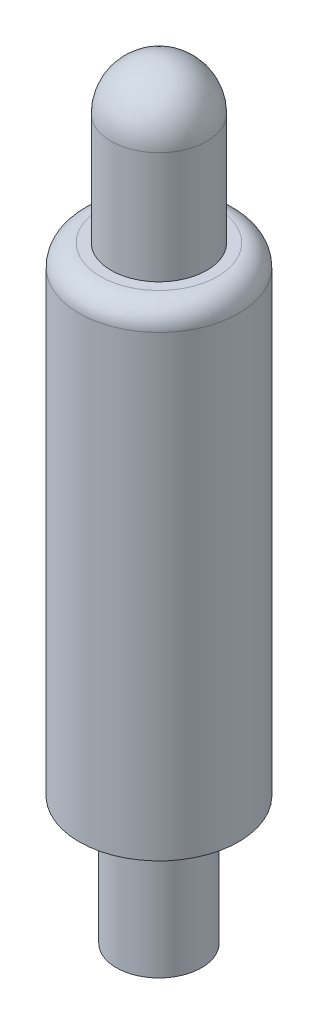
ISO-10303-21;
HEADER;
FILE_DESCRIPTION(('STEP AP214'),'2;1');
FILE_NAME('part.step','',(''),(''),'','','');
FILE_SCHEMA(('AUTOMOTIVE_DESIGN { 1 0 10303 214 1 1 1 1 }'));
ENDSEC;
DATA;
#1=APPLICATION_CONTEXT('core data for automotive mechanical design processes');
#2=APPLICATION_PROTOCOL_DEFINITION('international standard','automotive_design',2000,#1);
#3=PRODUCT_CONTEXT('',#1,'mechanical');
#4=PRODUCT('Part','Part','',(#3));
#5=PRODUCT_RELATED_PRODUCT_CATEGORY('part','',(#4));
#6=PRODUCT_DEFINITION_FORMATION('','',#4);
#7=PRODUCT_DEFINITION_CONTEXT('part definition',#1,'design');
#8=PRODUCT_DEFINITION('design','',#6,#7);
#9=PRODUCT_DEFINITION_SHAPE('','',#8);
#10=(LENGTH_UNIT() NAMED_UNIT(*) SI_UNIT(.MILLI.,.METRE.));
#11=(NAMED_UNIT(*) PLANE_ANGLE_UNIT() SI_UNIT($,.RADIAN.));
#12=(NAMED_UNIT(*) SI_UNIT($,.STERADIAN.) SOLID_ANGLE_UNIT());
#13=UNCERTAINTY_MEASURE_WITH_UNIT(LENGTH_MEASURE(1.E-05),#10,'distance_accuracy_value','');
#14=(GEOMETRIC_REPRESENTATION_CONTEXT(3) GLOBAL_UNCERTAINTY_ASSIGNED_CONTEXT((#13)) GLOBAL_UNIT_ASSIGNED_CONTEXT((#10,
#11,#12)) REPRESENTATION_CONTEXT('',''));
#15=CARTESIAN_POINT('',(0.,0.,0.));
#16=DIRECTION('',(0.,0.,1.));
#17=DIRECTION('',(1.,0.,0.));
#18=AXIS2_PLACEMENT_3D('',#15,#16,#17);
#19=CARTESIAN_POINT('',(0.,4.5,0.));
#20=DIRECTION('',(0.,-1.,0.));
#21=DIRECTION('',(0.,0.,-1.));
#22=AXIS2_PLACEMENT_3D('',#19,#20,#21);
#23=CYLINDRICAL_SURFACE('',#22,0.75);
#24=CARTESIAN_POINT('',(0.,4.3,0.));
#25=DIRECTION('',(0.,1.,0.));
#26=DIRECTION('',(0.,0.,1.));
#27=AXIS2_PLACEMENT_3D('',#24,#25,#26);
#28=CIRCLE('',#27,0.75);
#29=CARTESIAN_POINT('',(0.,4.3,0.75));
#30=VERTEX_POINT('',#29);
#31=EDGE_CURVE('E46',#30,#30,#28,.F.);
#32=ORIENTED_EDGE('',*,*,#31,.T.);
#33=EDGE_LOOP('',(#32));
#34=FACE_BOUND('',#33,.T.);
#35=CARTESIAN_POINT('',(0.,0.,0.));
#36=DIRECTION('',(0.,1.,0.));
#37=DIRECTION('',(0.,0.,1.));
#38=AXIS2_PLACEMENT_3D('',#35,#36,#37);
#39=CIRCLE('',#38,0.75);
#40=CARTESIAN_POINT('',(0.,0.,0.75));
#41=VERTEX_POINT('',#40);
#42=EDGE_CURVE('E57',#41,#41,#39,.T.);
#43=ORIENTED_EDGE('',*,*,#42,.T.);
#44=EDGE_LOOP('',(#43));
#45=FACE_BOUND('',#44,.T.);
#46=ADVANCED_FACE('F39',(#34,#45),#23,.T.);
#47=CARTESIAN_POINT('',(0.,4.5,0.));
#48=DIRECTION('',(0.,1.,0.));
#49=DIRECTION('',(0.,0.,1.));
#50=AXIS2_PLACEMENT_3D('',#47,#48,#49);
#51=PLANE('',#50);
#52=CARTESIAN_POINT('',(0.,4.5,0.));
#53=DIRECTION('',(0.,1.,0.));
#54=DIRECTION('',(0.,0.,1.));
#55=AXIS2_PLACEMENT_3D('',#52,#53,#54);
#56=CIRCLE('',#55,0.55);
#57=CARTESIAN_POINT('',(0.,4.5,0.55));
#58=VERTEX_POINT('',#57);
#59=EDGE_CURVE('E50',#58,#58,#56,.T.);
#60=ORIENTED_EDGE('',*,*,#59,.T.);
#61=EDGE_LOOP('',(#60));
#62=FACE_BOUND('',#61,.T.);
#63=CARTESIAN_POINT('',(0.,4.5,0.));
#64=DIRECTION('',(0.,1.,0.));
#65=DIRECTION('',(0.,0.,1.));
#66=AXIS2_PLACEMENT_3D('',#63,#64,#65);
#67=CIRCLE('',#66,0.45);
#68=CARTESIAN_POINT('',(0.,4.5,0.45));
#69=VERTEX_POINT('',#68);
#70=EDGE_CURVE('E60',#69,#69,#67,.T.);
#71=ORIENTED_EDGE('',*,*,#70,.F.);
#72=EDGE_LOOP('',(#71));
#73=FACE_BOUND('',#72,.T.);
#74=ADVANCED_FACE('F81',(#62,#73),#51,.T.);
#75=CARTESIAN_POINT('',(0.,0.,0.));
#76=DIRECTION('',(0.,1.,0.));
#77=DIRECTION('',(0.,0.,1.));
#78=AXIS2_PLACEMENT_3D('',#75,#76,#77);
#79=PLANE('',#78);
#80=CARTESIAN_POINT('',(0.,0.,0.));
#81=DIRECTION('',(0.,-1.,0.));
#82=DIRECTION('',(0.,0.,-1.));
#83=AXIS2_PLACEMENT_3D('',#80,#81,#82);
#84=CIRCLE('',#83,0.4);
#85=CARTESIAN_POINT('',(0.,0.,-0.4));
#86=VERTEX_POINT('',#85);
#87=EDGE_CURVE('E54',#86,#86,#84,.T.);
#88=ORIENTED_EDGE('',*,*,#87,.F.);
#89=EDGE_LOOP('',(#88));
#90=FACE_BOUND('',#89,.T.);
#91=ORIENTED_EDGE('',*,*,#42,.F.);
#92=EDGE_LOOP('',(#91));
#93=FACE_BOUND('',#92,.T.);
#94=ADVANCED_FACE('F78',(#90,#93),#79,.F.);
#95=CARTESIAN_POINT('',(0.,6.,0.));
#96=DIRECTION('',(0.,-1.,0.));
#97=DIRECTION('',(0.,0.,-1.));
#98=AXIS2_PLACEMENT_3D('',#95,#96,#97);
#99=CYLINDRICAL_SURFACE('',#98,0.45);
#100=CARTESIAN_POINT('',(0.,5.55,0.));
#101=DIRECTION('',(0.,-1.,0.));
#102=DIRECTION('',(0.,0.,-1.));
#103=AXIS2_PLACEMENT_3D('',#100,#101,#102);
#104=CIRCLE('',#103,0.45);
#105=CARTESIAN_POINT('',(0.,5.55,-0.45));
#106=VERTEX_POINT('',#105);
#107=EDGE_CURVE('E10',#106,#106,#104,.T.);
#108=ORIENTED_EDGE('',*,*,#107,.T.);
#109=EDGE_LOOP('',(#108));
#110=FACE_BOUND('',#109,.T.);
#111=ORIENTED_EDGE('',*,*,#70,.T.);
#112=EDGE_LOOP('',(#111));
#113=FACE_BOUND('',#112,.T.);
#114=ADVANCED_FACE('F74',(#110,#113),#99,.T.);
#115=CARTESIAN_POINT('',(0.,-1.2,0.));
#116=DIRECTION('',(0.,1.,0.));
#117=DIRECTION('',(0.,0.,1.));
#118=AXIS2_PLACEMENT_3D('',#115,#116,#117);
#119=CYLINDRICAL_SURFACE('',#118,0.4);
#120=CARTESIAN_POINT('',(0.,-1.2,0.));
#121=DIRECTION('',(0.,-1.,0.));
#122=DIRECTION('',(0.,0.,-1.));
#123=AXIS2_PLACEMENT_3D('',#120,#121,#122);
#124=CIRCLE('',#123,0.4);
#125=CARTESIAN_POINT('',(0.,-1.2,-0.4));
#126=VERTEX_POINT('',#125);
#127=EDGE_CURVE('E61',#126,#126,#124,.T.);
#128=ORIENTED_EDGE('',*,*,#127,.F.);
#129=EDGE_LOOP('',(#128));
#130=FACE_BOUND('',#129,.T.);
#131=ORIENTED_EDGE('',*,*,#87,.T.);
#132=EDGE_LOOP('',(#131));
#133=FACE_BOUND('',#132,.T.);
#134=ADVANCED_FACE('F71',(#130,#133),#119,.T.);
#135=CARTESIAN_POINT('',(0.,-1.2,0.));
#136=DIRECTION('',(0.,-1.,0.));
#137=DIRECTION('',(0.,0.,-1.));
#138=AXIS2_PLACEMENT_3D('',#135,#136,#137);
#139=PLANE('',#138);
#140=ORIENTED_EDGE('',*,*,#127,.T.);
#141=EDGE_LOOP('',(#140));
#142=FACE_BOUND('',#141,.T.);
#143=ADVANCED_FACE('F69',(#142),#139,.T.);
#144=CARTESIAN_POINT('',(0.,4.3,0.));
#145=DIRECTION('',(0.,1.,0.));
#146=DIRECTION('',(0.,0.,1.));
#147=AXIS2_PLACEMENT_3D('',#144,#145,#146);
#148=TOROIDAL_SURFACE('',#147,0.55,0.2);
#149=ORIENTED_EDGE('',*,*,#31,.F.);
#150=EDGE_LOOP('',(#149));
#151=FACE_BOUND('',#150,.T.);
#152=ORIENTED_EDGE('',*,*,#59,.F.);
#153=EDGE_LOOP('',(#152));
#154=FACE_BOUND('',#153,.T.);
#155=ADVANCED_FACE('F92',(#151,#154),#148,.T.);
#156=CARTESIAN_POINT('',(0.,5.55,0.));
#157=DIRECTION('',(0.,1.,0.));
#158=DIRECTION('',(0.,0.,1.));
#159=AXIS2_PLACEMENT_3D('',#156,#157,#158);
#160=SPHERICAL_SURFACE('',#159,0.45);
#161=ORIENTED_EDGE('',*,*,#107,.F.);
#162=EDGE_LOOP('',(#161));
#163=FACE_BOUND('',#162,.T.);
#164=ADVANCED_FACE('F41',(#163),#160,.T.);
#165=CLOSED_SHELL('',(#46,#74,#94,#114,#134,#143,#155,#164));
#166=MANIFOLD_SOLID_BREP('B2',#165);
#167=ADVANCED_BREP_SHAPE_REPRESENTATION('',(#18,#166),#14);
#168=SHAPE_DEFINITION_REPRESENTATION(#9,#167);
ENDSEC;
END-ISO-10303-21;
